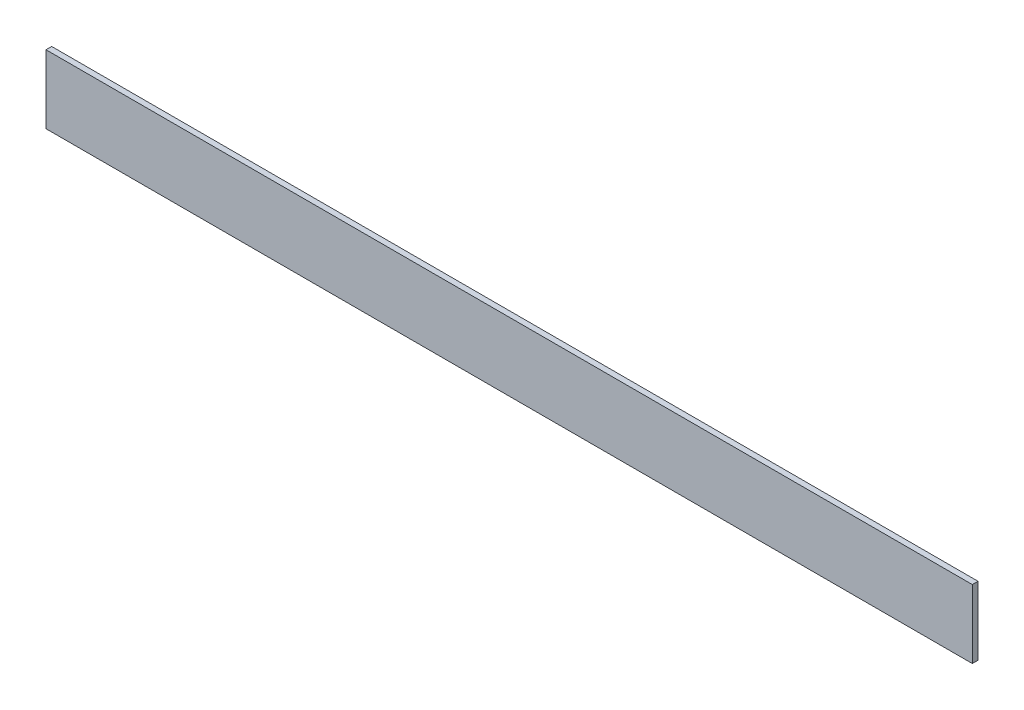
ISO-10303-21;
HEADER;
FILE_DESCRIPTION(('STEP AP214'),'2;1');
FILE_NAME('part.step','',(''),(''),'','','');
FILE_SCHEMA(('AUTOMOTIVE_DESIGN { 1 0 10303 214 1 1 1 1 }'));
ENDSEC;
DATA;
#1=APPLICATION_CONTEXT('core data for automotive mechanical design processes');
#2=APPLICATION_PROTOCOL_DEFINITION('international standard','automotive_design',2000,#1);
#3=PRODUCT_CONTEXT('',#1,'mechanical');
#4=PRODUCT('Part','Part','',(#3));
#5=PRODUCT_RELATED_PRODUCT_CATEGORY('part','',(#4));
#6=PRODUCT_DEFINITION_FORMATION('','',#4);
#7=PRODUCT_DEFINITION_CONTEXT('part definition',#1,'design');
#8=PRODUCT_DEFINITION('design','',#6,#7);
#9=PRODUCT_DEFINITION_SHAPE('','',#8);
#10=(LENGTH_UNIT() NAMED_UNIT(*) SI_UNIT(.MILLI.,.METRE.));
#11=(NAMED_UNIT(*) PLANE_ANGLE_UNIT() SI_UNIT($,.RADIAN.));
#12=(NAMED_UNIT(*) SI_UNIT($,.STERADIAN.) SOLID_ANGLE_UNIT());
#13=UNCERTAINTY_MEASURE_WITH_UNIT(LENGTH_MEASURE(1.E-05),#10,'distance_accuracy_value','');
#14=(GEOMETRIC_REPRESENTATION_CONTEXT(3) GLOBAL_UNCERTAINTY_ASSIGNED_CONTEXT((#13)) GLOBAL_UNIT_ASSIGNED_CONTEXT((#10,
#11,#12)) REPRESENTATION_CONTEXT('',''));
#15=CARTESIAN_POINT('',(0.,0.,0.));
#16=DIRECTION('',(0.,0.,1.));
#17=DIRECTION('',(1.,0.,0.));
#18=AXIS2_PLACEMENT_3D('',#15,#16,#17);
#19=CARTESIAN_POINT('',(515.874,38.1,6.35));
#20=DIRECTION('',(-1.,0.,0.));
#21=DIRECTION('',(0.,0.,1.));
#22=AXIS2_PLACEMENT_3D('',#19,#20,#21);
#23=PLANE('',#22);
#24=DIRECTION('',(0.,1.,0.));
#25=VECTOR('',#24,1.);
#26=CARTESIAN_POINT('',(515.874,38.1,0.));
#27=LINE('',#26,#25);
#28=CARTESIAN_POINT('',(515.874,-38.1,0.));
#29=VERTEX_POINT('',#28);
#30=CARTESIAN_POINT('',(515.874,38.1,0.));
#31=VERTEX_POINT('',#30);
#32=EDGE_CURVE('E96',#29,#31,#27,.T.);
#33=ORIENTED_EDGE('',*,*,#32,.T.);
#34=DIRECTION('',(0.,0.,-1.));
#35=VECTOR('',#34,1.);
#36=CARTESIAN_POINT('',(515.874,38.1,6.35));
#37=LINE('',#36,#35);
#38=CARTESIAN_POINT('',(515.874,38.1,6.35));
#39=VERTEX_POINT('',#38);
#40=EDGE_CURVE('E11',#39,#31,#37,.T.);
#41=ORIENTED_EDGE('',*,*,#40,.F.);
#42=DIRECTION('',(0.,1.,0.));
#43=VECTOR('',#42,1.);
#44=CARTESIAN_POINT('',(515.874,38.1,6.35));
#45=LINE('',#44,#43);
#46=CARTESIAN_POINT('',(515.874,-38.1,6.35));
#47=VERTEX_POINT('',#46);
#48=EDGE_CURVE('E84',#47,#39,#45,.T.);
#49=ORIENTED_EDGE('',*,*,#48,.F.);
#50=DIRECTION('',(0.,0.,-1.));
#51=VECTOR('',#50,1.);
#52=CARTESIAN_POINT('',(515.874,-38.1,6.35));
#53=LINE('',#52,#51);
#54=EDGE_CURVE('E92',#47,#29,#53,.T.);
#55=ORIENTED_EDGE('',*,*,#54,.T.);
#56=EDGE_LOOP('',(#33,#41,#49,#55));
#57=FACE_BOUND('',#56,.T.);
#58=ADVANCED_FACE('F33',(#57),#23,.F.);
#59=CARTESIAN_POINT('',(-515.874,38.1,6.35));
#60=DIRECTION('',(0.,-1.,0.));
#61=DIRECTION('',(0.,0.,-1.));
#62=AXIS2_PLACEMENT_3D('',#59,#60,#61);
#63=PLANE('',#62);
#64=DIRECTION('',(-1.,0.,0.));
#65=VECTOR('',#64,1.);
#66=CARTESIAN_POINT('',(-515.874,38.1,0.));
#67=LINE('',#66,#65);
#68=CARTESIAN_POINT('',(-515.874,38.1,0.));
#69=VERTEX_POINT('',#68);
#70=EDGE_CURVE('E88',#31,#69,#67,.T.);
#71=ORIENTED_EDGE('',*,*,#70,.T.);
#72=DIRECTION('',(0.,0.,-1.));
#73=VECTOR('',#72,1.);
#74=CARTESIAN_POINT('',(-515.874,38.1,6.35));
#75=LINE('',#74,#73);
#76=CARTESIAN_POINT('',(-515.874,38.1,6.35));
#77=VERTEX_POINT('',#76);
#78=EDGE_CURVE('E41',#77,#69,#75,.T.);
#79=ORIENTED_EDGE('',*,*,#78,.F.);
#80=DIRECTION('',(-1.,0.,0.));
#81=VECTOR('',#80,1.);
#82=CARTESIAN_POINT('',(-515.874,38.1,6.35));
#83=LINE('',#82,#81);
#84=EDGE_CURVE('E79',#39,#77,#83,.T.);
#85=ORIENTED_EDGE('',*,*,#84,.F.);
#86=ORIENTED_EDGE('',*,*,#40,.T.);
#87=EDGE_LOOP('',(#71,#79,#85,#86));
#88=FACE_BOUND('',#87,.T.);
#89=ADVANCED_FACE('F87',(#88),#63,.F.);
#90=CARTESIAN_POINT('',(-515.874,38.1,6.35));
#91=DIRECTION('',(1.,0.,0.));
#92=DIRECTION('',(0.,0.,-1.));
#93=AXIS2_PLACEMENT_3D('',#90,#91,#92);
#94=PLANE('',#93);
#95=DIRECTION('',(0.,-1.,0.));
#96=VECTOR('',#95,1.);
#97=CARTESIAN_POINT('',(-515.874,38.1,0.));
#98=LINE('',#97,#96);
#99=CARTESIAN_POINT('',(-515.874,-38.1,0.));
#100=VERTEX_POINT('',#99);
#101=EDGE_CURVE('E66',#69,#100,#98,.T.);
#102=ORIENTED_EDGE('',*,*,#101,.T.);
#103=DIRECTION('',(0.,0.,-1.));
#104=VECTOR('',#103,1.);
#105=CARTESIAN_POINT('',(-515.874,-38.1,6.35));
#106=LINE('',#105,#104);
#107=CARTESIAN_POINT('',(-515.874,-38.1,6.35));
#108=VERTEX_POINT('',#107);
#109=EDGE_CURVE('E89',#108,#100,#106,.T.);
#110=ORIENTED_EDGE('',*,*,#109,.F.);
#111=DIRECTION('',(0.,-1.,0.));
#112=VECTOR('',#111,1.);
#113=CARTESIAN_POINT('',(-515.874,38.1,6.35));
#114=LINE('',#113,#112);
#115=EDGE_CURVE('E82',#77,#108,#114,.T.);
#116=ORIENTED_EDGE('',*,*,#115,.F.);
#117=ORIENTED_EDGE('',*,*,#78,.T.);
#118=EDGE_LOOP('',(#102,#110,#116,#117));
#119=FACE_BOUND('',#118,.T.);
#120=ADVANCED_FACE('F90',(#119),#94,.F.);
#121=CARTESIAN_POINT('',(-515.874,-38.1,6.35));
#122=DIRECTION('',(0.,1.,0.));
#123=DIRECTION('',(0.,0.,1.));
#124=AXIS2_PLACEMENT_3D('',#121,#122,#123);
#125=PLANE('',#124);
#126=DIRECTION('',(1.,0.,0.));
#127=VECTOR('',#126,1.);
#128=CARTESIAN_POINT('',(-515.874,-38.1,0.));
#129=LINE('',#128,#127);
#130=EDGE_CURVE('E72',#100,#29,#129,.T.);
#131=ORIENTED_EDGE('',*,*,#130,.T.);
#132=ORIENTED_EDGE('',*,*,#54,.F.);
#133=DIRECTION('',(1.,0.,0.));
#134=VECTOR('',#133,1.);
#135=CARTESIAN_POINT('',(-515.874,-38.1,6.35));
#136=LINE('',#135,#134);
#137=EDGE_CURVE('E49',#108,#47,#136,.T.);
#138=ORIENTED_EDGE('',*,*,#137,.F.);
#139=ORIENTED_EDGE('',*,*,#109,.T.);
#140=EDGE_LOOP('',(#131,#132,#138,#139));
#141=FACE_BOUND('',#140,.T.);
#142=ADVANCED_FACE('F103',(#141),#125,.F.);
#143=CARTESIAN_POINT('',(0.,0.,6.35));
#144=DIRECTION('',(0.,0.,1.));
#145=DIRECTION('',(1.,0.,0.));
#146=AXIS2_PLACEMENT_3D('',#143,#144,#145);
#147=PLANE('',#146);
#148=ORIENTED_EDGE('',*,*,#48,.T.);
#149=ORIENTED_EDGE('',*,*,#84,.T.);
#150=ORIENTED_EDGE('',*,*,#115,.T.);
#151=ORIENTED_EDGE('',*,*,#137,.T.);
#152=EDGE_LOOP('',(#148,#149,#150,#151));
#153=FACE_BOUND('',#152,.T.);
#154=ADVANCED_FACE('F80',(#153),#147,.T.);
#155=CARTESIAN_POINT('',(0.,0.,0.));
#156=DIRECTION('',(0.,0.,1.));
#157=DIRECTION('',(1.,0.,0.));
#158=AXIS2_PLACEMENT_3D('',#155,#156,#157);
#159=PLANE('',#158);
#160=ORIENTED_EDGE('',*,*,#32,.F.);
#161=ORIENTED_EDGE('',*,*,#130,.F.);
#162=ORIENTED_EDGE('',*,*,#101,.F.);
#163=ORIENTED_EDGE('',*,*,#70,.F.);
#164=EDGE_LOOP('',(#160,#161,#162,#163));
#165=FACE_BOUND('',#164,.T.);
#166=ADVANCED_FACE('F106',(#165),#159,.F.);
#167=CLOSED_SHELL('',(#58,#89,#120,#142,#154,#166));
#168=MANIFOLD_SOLID_BREP('B2',#167);
#169=ADVANCED_BREP_SHAPE_REPRESENTATION('',(#18,#168),#14);
#170=SHAPE_DEFINITION_REPRESENTATION(#9,#169);
ENDSEC;
END-ISO-10303-21;
